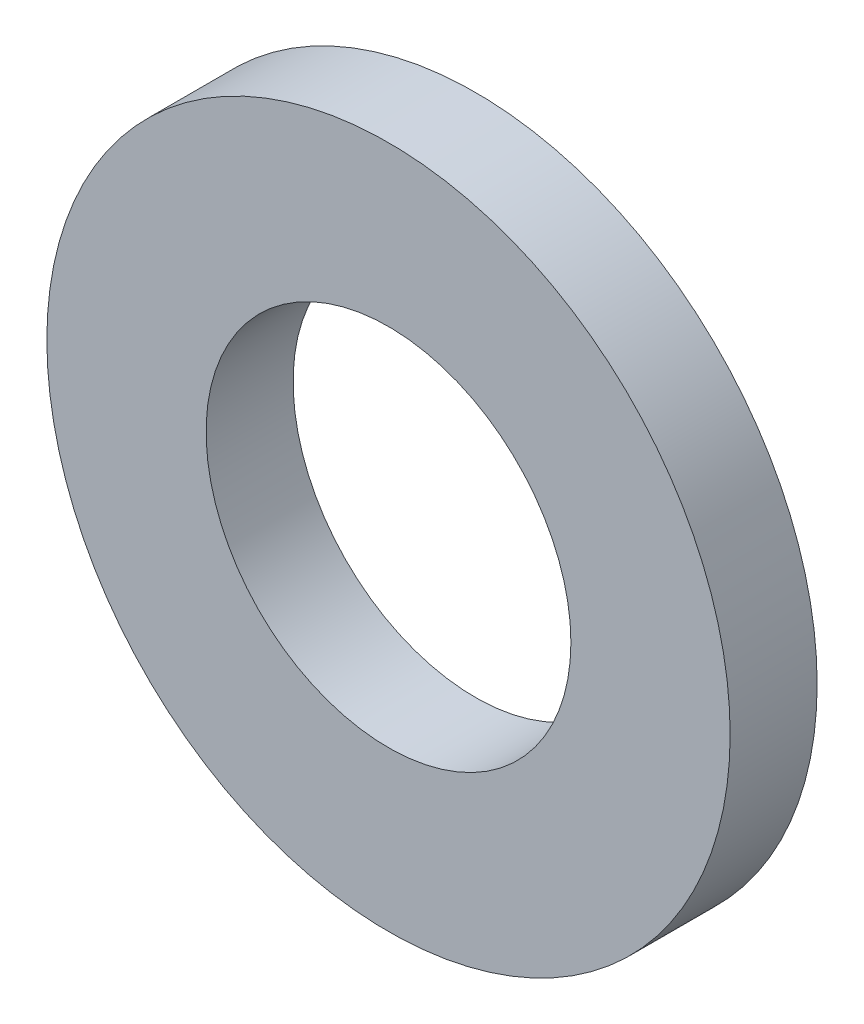
ISO-10303-21;
HEADER;
FILE_DESCRIPTION(('STEP AP214'),'2;1');
FILE_NAME('part.step','',(''),(''),'','','');
FILE_SCHEMA(('AUTOMOTIVE_DESIGN { 1 0 10303 214 1 1 1 1 }'));
ENDSEC;
DATA;
#1=APPLICATION_CONTEXT('core data for automotive mechanical design processes');
#2=APPLICATION_PROTOCOL_DEFINITION('international standard','automotive_design',2000,#1);
#3=PRODUCT_CONTEXT('',#1,'mechanical');
#4=PRODUCT('Part','Part','',(#3));
#5=PRODUCT_RELATED_PRODUCT_CATEGORY('part','',(#4));
#6=PRODUCT_DEFINITION_FORMATION('','',#4);
#7=PRODUCT_DEFINITION_CONTEXT('part definition',#1,'design');
#8=PRODUCT_DEFINITION('design','',#6,#7);
#9=PRODUCT_DEFINITION_SHAPE('','',#8);
#10=(LENGTH_UNIT() NAMED_UNIT(*) SI_UNIT(.MILLI.,.METRE.));
#11=(NAMED_UNIT(*) PLANE_ANGLE_UNIT() SI_UNIT($,.RADIAN.));
#12=(NAMED_UNIT(*) SI_UNIT($,.STERADIAN.) SOLID_ANGLE_UNIT());
#13=UNCERTAINTY_MEASURE_WITH_UNIT(LENGTH_MEASURE(1.E-05),#10,'distance_accuracy_value','');
#14=(GEOMETRIC_REPRESENTATION_CONTEXT(3) GLOBAL_UNCERTAINTY_ASSIGNED_CONTEXT((#13)) GLOBAL_UNIT_ASSIGNED_CONTEXT((#10,
#11,#12)) REPRESENTATION_CONTEXT('',''));
#15=CARTESIAN_POINT('',(0.,0.,0.));
#16=DIRECTION('',(0.,0.,1.));
#17=DIRECTION('',(1.,0.,0.));
#18=AXIS2_PLACEMENT_3D('',#15,#16,#17);
#19=CARTESIAN_POINT('',(0.,0.,1.5748));
#20=DIRECTION('',(0.,0.,1.));
#21=DIRECTION('',(1.,0.,0.));
#22=AXIS2_PLACEMENT_3D('',#19,#20,#21);
#23=PLANE('',#22);
#24=CARTESIAN_POINT('',(0.,0.,1.5748));
#25=DIRECTION('',(0.,0.,1.));
#26=DIRECTION('',(1.,0.,0.));
#27=AXIS2_PLACEMENT_3D('',#24,#25,#26);
#28=CIRCLE('',#27,6.1849);
#29=CARTESIAN_POINT('',(6.1849,0.,1.5748));
#30=VERTEX_POINT('',#29);
#31=EDGE_CURVE('E10',#30,#30,#28,.T.);
#32=ORIENTED_EDGE('',*,*,#31,.T.);
#33=EDGE_LOOP('',(#32));
#34=FACE_BOUND('',#33,.T.);
#35=CARTESIAN_POINT('',(0.,0.,1.5748));
#36=DIRECTION('',(0.,0.,1.));
#37=DIRECTION('',(1.,0.,0.));
#38=AXIS2_PLACEMENT_3D('',#35,#36,#37);
#39=CIRCLE('',#38,3.302);
#40=CARTESIAN_POINT('',(3.302,0.,1.5748));
#41=VERTEX_POINT('',#40);
#42=EDGE_CURVE('E43',#41,#41,#39,.T.);
#43=ORIENTED_EDGE('',*,*,#42,.F.);
#44=EDGE_LOOP('',(#43));
#45=FACE_BOUND('',#44,.T.);
#46=ADVANCED_FACE('F32',(#34,#45),#23,.T.);
#47=CARTESIAN_POINT('',(0.,0.,0.));
#48=DIRECTION('',(0.,0.,1.));
#49=DIRECTION('',(1.,0.,0.));
#50=AXIS2_PLACEMENT_3D('',#47,#48,#49);
#51=PLANE('',#50);
#52=CARTESIAN_POINT('',(0.,0.,0.));
#53=DIRECTION('',(0.,0.,1.));
#54=DIRECTION('',(1.,0.,0.));
#55=AXIS2_PLACEMENT_3D('',#52,#53,#54);
#56=CIRCLE('',#55,6.1849);
#57=CARTESIAN_POINT('',(6.1849,0.,0.));
#58=VERTEX_POINT('',#57);
#59=EDGE_CURVE('E36',#58,#58,#56,.T.);
#60=ORIENTED_EDGE('',*,*,#59,.F.);
#61=EDGE_LOOP('',(#60));
#62=FACE_BOUND('',#61,.T.);
#63=CARTESIAN_POINT('',(0.,0.,0.));
#64=DIRECTION('',(0.,0.,1.));
#65=DIRECTION('',(1.,0.,0.));
#66=AXIS2_PLACEMENT_3D('',#63,#64,#65);
#67=CIRCLE('',#66,3.302);
#68=CARTESIAN_POINT('',(3.302,0.,0.));
#69=VERTEX_POINT('',#68);
#70=EDGE_CURVE('E45',#69,#69,#67,.T.);
#71=ORIENTED_EDGE('',*,*,#70,.T.);
#72=EDGE_LOOP('',(#71));
#73=FACE_BOUND('',#72,.T.);
#74=ADVANCED_FACE('F55',(#62,#73),#51,.F.);
#75=CARTESIAN_POINT('',(0.,0.,1.5748));
#76=DIRECTION('',(0.,0.,-1.));
#77=DIRECTION('',(-1.,0.,0.));
#78=AXIS2_PLACEMENT_3D('',#75,#76,#77);
#79=CYLINDRICAL_SURFACE('',#78,6.1849);
#80=ORIENTED_EDGE('',*,*,#31,.F.);
#81=EDGE_LOOP('',(#80));
#82=FACE_BOUND('',#81,.T.);
#83=ORIENTED_EDGE('',*,*,#59,.T.);
#84=EDGE_LOOP('',(#83));
#85=FACE_BOUND('',#84,.T.);
#86=ADVANCED_FACE('F34',(#82,#85),#79,.T.);
#87=CARTESIAN_POINT('',(0.,0.,1.5748));
#88=DIRECTION('',(0.,0.,-1.));
#89=DIRECTION('',(-1.,0.,0.));
#90=AXIS2_PLACEMENT_3D('',#87,#88,#89);
#91=CYLINDRICAL_SURFACE('',#90,3.302);
#92=ORIENTED_EDGE('',*,*,#42,.T.);
#93=EDGE_LOOP('',(#92));
#94=FACE_BOUND('',#93,.T.);
#95=ORIENTED_EDGE('',*,*,#70,.F.);
#96=EDGE_LOOP('',(#95));
#97=FACE_BOUND('',#96,.T.);
#98=ADVANCED_FACE('F51',(#94,#97),#91,.F.);
#99=CLOSED_SHELL('',(#46,#74,#86,#98));
#100=MANIFOLD_SOLID_BREP('B2',#99);
#101=ADVANCED_BREP_SHAPE_REPRESENTATION('',(#18,#100),#14);
#102=SHAPE_DEFINITION_REPRESENTATION(#9,#101);
ENDSEC;
END-ISO-10303-21;
